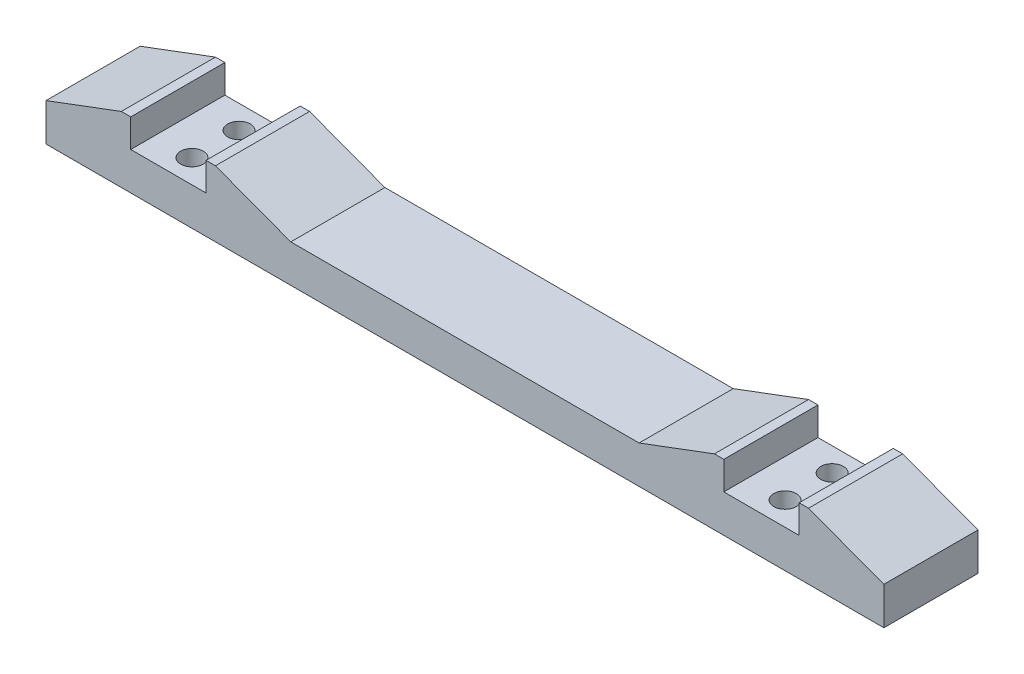
ISO-10303-21;
HEADER;
FILE_DESCRIPTION(('STEP AP214'),'2;1');
FILE_NAME('part.step','',(''),(''),'','','');
FILE_SCHEMA(('AUTOMOTIVE_DESIGN { 1 0 10303 214 1 1 1 1 }'));
ENDSEC;
DATA;
#1=APPLICATION_CONTEXT('core data for automotive mechanical design processes');
#2=APPLICATION_PROTOCOL_DEFINITION('international standard','automotive_design',2000,#1);
#3=PRODUCT_CONTEXT('',#1,'mechanical');
#4=PRODUCT('Part','Part','',(#3));
#5=PRODUCT_RELATED_PRODUCT_CATEGORY('part','',(#4));
#6=PRODUCT_DEFINITION_FORMATION('','',#4);
#7=PRODUCT_DEFINITION_CONTEXT('part definition',#1,'design');
#8=PRODUCT_DEFINITION('design','',#6,#7);
#9=PRODUCT_DEFINITION_SHAPE('','',#8);
#10=(LENGTH_UNIT() NAMED_UNIT(*) SI_UNIT(.MILLI.,.METRE.));
#11=(NAMED_UNIT(*) PLANE_ANGLE_UNIT() SI_UNIT($,.RADIAN.));
#12=(NAMED_UNIT(*) SI_UNIT($,.STERADIAN.) SOLID_ANGLE_UNIT());
#13=UNCERTAINTY_MEASURE_WITH_UNIT(LENGTH_MEASURE(1.E-05),#10,'distance_accuracy_value','');
#14=(GEOMETRIC_REPRESENTATION_CONTEXT(3) GLOBAL_UNCERTAINTY_ASSIGNED_CONTEXT((#13)) GLOBAL_UNIT_ASSIGNED_CONTEXT((#10,
#11,#12)) REPRESENTATION_CONTEXT('',''));
#15=CARTESIAN_POINT('',(0.,0.,0.));
#16=DIRECTION('',(0.,0.,1.));
#17=DIRECTION('',(1.,0.,0.));
#18=AXIS2_PLACEMENT_3D('',#15,#16,#17);
#19=CARTESIAN_POINT('',(2.,-3.5,1.25));
#20=DIRECTION('',(0.,1.,0.));
#21=DIRECTION('',(0.,0.,1.));
#22=AXIS2_PLACEMENT_3D('',#19,#20,#21);
#23=CYLINDRICAL_SURFACE('',#22,0.6);
#24=CARTESIAN_POINT('',(2.,-1.5,1.25));
#25=DIRECTION('',(0.,1.,0.));
#26=DIRECTION('',(0.,0.,1.));
#27=AXIS2_PLACEMENT_3D('',#24,#25,#26);
#28=CIRCLE('',#27,0.6);
#29=CARTESIAN_POINT('',(2.,-1.5,1.85));
#30=VERTEX_POINT('',#29);
#31=EDGE_CURVE('E312',#30,#30,#28,.T.);
#32=ORIENTED_EDGE('',*,*,#31,.T.);
#33=EDGE_LOOP('',(#32));
#34=FACE_BOUND('',#33,.T.);
#35=CARTESIAN_POINT('',(2.,-2.5,1.25));
#36=DIRECTION('',(0.,-1.,0.));
#37=DIRECTION('',(1.,0.,0.));
#38=AXIS2_PLACEMENT_3D('',#35,#36,#37);
#39=CIRCLE('',#38,0.6);
#40=CARTESIAN_POINT('',(2.6,-2.5,1.25));
#41=VERTEX_POINT('',#40);
#42=EDGE_CURVE('E47',#41,#41,#39,.F.);
#43=ORIENTED_EDGE('',*,*,#42,.F.);
#44=EDGE_LOOP('',(#43));
#45=FACE_BOUND('',#44,.T.);
#46=ADVANCED_FACE('F43',(#34,#45),#23,.F.);
#47=CARTESIAN_POINT('',(0.,0.,2.5));
#48=DIRECTION('',(0.,-1.,0.));
#49=DIRECTION('',(1.,0.,0.));
#50=AXIS2_PLACEMENT_3D('',#47,#48,#49);
#51=PLANE('',#50);
#52=DIRECTION('',(-1.,0.,0.));
#53=VECTOR('',#52,1.);
#54=CARTESIAN_POINT('',(0.,0.,0.));
#55=LINE('',#54,#53);
#56=CARTESIAN_POINT('',(0.,0.,0.));
#57=VERTEX_POINT('',#56);
#58=CARTESIAN_POINT('',(-0.5,0.,0.));
#59=VERTEX_POINT('',#58);
#60=EDGE_CURVE('E315',#57,#59,#55,.T.);
#61=ORIENTED_EDGE('',*,*,#60,.T.);
#62=DIRECTION('',(0.,0.,-1.));
#63=VECTOR('',#62,1.);
#64=CARTESIAN_POINT('',(-0.5,0.,2.5));
#65=LINE('',#64,#63);
#66=CARTESIAN_POINT('',(-0.5,0.,5.));
#67=VERTEX_POINT('',#66);
#68=EDGE_CURVE('E11',#67,#59,#65,.T.);
#69=ORIENTED_EDGE('',*,*,#68,.F.);
#70=DIRECTION('',(-1.,0.,0.));
#71=VECTOR('',#70,1.);
#72=CARTESIAN_POINT('',(0.,0.,5.));
#73=LINE('',#72,#71);
#74=CARTESIAN_POINT('',(0.,0.,5.));
#75=VERTEX_POINT('',#74);
#76=EDGE_CURVE('E277',#75,#67,#73,.T.);
#77=ORIENTED_EDGE('',*,*,#76,.F.);
#78=DIRECTION('',(0.,0.,-1.));
#79=VECTOR('',#78,1.);
#80=CARTESIAN_POINT('',(0.,0.,2.5));
#81=LINE('',#80,#79);
#82=EDGE_CURVE('E59',#75,#57,#81,.T.);
#83=ORIENTED_EDGE('',*,*,#82,.T.);
#84=EDGE_LOOP('',(#61,#69,#77,#83));
#85=FACE_BOUND('',#84,.T.);
#86=ADVANCED_FACE('F45',(#85),#51,.F.);
#87=CARTESIAN_POINT('',(-0.0616438356164384,0.164383561643836,2.5));
#88=DIRECTION('',(0.351123441588392,-0.936329177569044,0.));
#89=DIRECTION('',(0.936329177569044,0.351123441588392,0.));
#90=AXIS2_PLACEMENT_3D('',#87,#88,#89);
#91=PLANE('',#90);
#92=DIRECTION('',(-0.936329177569044,-0.351123441588392,0.));
#93=VECTOR('',#92,1.);
#94=CARTESIAN_POINT('',(-0.0616438356164384,0.164383561643836,0.));
#95=LINE('',#94,#93);
#96=CARTESIAN_POINT('',(-4.5,-1.5,0.));
#97=VERTEX_POINT('',#96);
#98=EDGE_CURVE('E317',#59,#97,#95,.T.);
#99=ORIENTED_EDGE('',*,*,#98,.T.);
#100=DIRECTION('',(0.,0.,-1.));
#101=VECTOR('',#100,1.);
#102=CARTESIAN_POINT('',(-4.5,-1.5,2.5));
#103=LINE('',#102,#101);
#104=CARTESIAN_POINT('',(-4.5,-1.5,5.));
#105=VERTEX_POINT('',#104);
#106=EDGE_CURVE('E52',#105,#97,#103,.T.);
#107=ORIENTED_EDGE('',*,*,#106,.F.);
#108=DIRECTION('',(-0.936329177569044,-0.351123441588392,0.));
#109=VECTOR('',#108,1.);
#110=CARTESIAN_POINT('',(-0.0616438356164384,0.164383561643836,5.));
#111=LINE('',#110,#109);
#112=EDGE_CURVE('E279',#67,#105,#111,.T.);
#113=ORIENTED_EDGE('',*,*,#112,.F.);
#114=ORIENTED_EDGE('',*,*,#68,.T.);
#115=EDGE_LOOP('',(#99,#107,#113,#114));
#116=FACE_BOUND('',#115,.T.);
#117=ADVANCED_FACE('F361',(#116),#91,.F.);
#118=CARTESIAN_POINT('',(-4.5,0.,2.5));
#119=DIRECTION('',(-1.,0.,0.));
#120=DIRECTION('',(0.,-1.,0.));
#121=AXIS2_PLACEMENT_3D('',#118,#119,#120);
#122=PLANE('',#121);
#123=DIRECTION('',(0.,1.,0.));
#124=VECTOR('',#123,1.);
#125=CARTESIAN_POINT('',(-4.5,0.,0.));
#126=LINE('',#125,#124);
#127=CARTESIAN_POINT('',(-4.5,-3.5,0.));
#128=VERTEX_POINT('',#127);
#129=EDGE_CURVE('E320',#128,#97,#126,.T.);
#130=ORIENTED_EDGE('',*,*,#129,.F.);
#131=DIRECTION('',(0.,0.,-1.));
#132=VECTOR('',#131,1.);
#133=CARTESIAN_POINT('',(-4.5,-3.5,2.5));
#134=LINE('',#133,#132);
#135=CARTESIAN_POINT('',(-4.5,-3.5,5.));
#136=VERTEX_POINT('',#135);
#137=EDGE_CURVE('E353',#136,#128,#134,.T.);
#138=ORIENTED_EDGE('',*,*,#137,.F.);
#139=DIRECTION('',(0.,1.,0.));
#140=VECTOR('',#139,1.);
#141=CARTESIAN_POINT('',(-4.5,0.,5.));
#142=LINE('',#141,#140);
#143=EDGE_CURVE('E282',#136,#105,#142,.T.);
#144=ORIENTED_EDGE('',*,*,#143,.T.);
#145=ORIENTED_EDGE('',*,*,#106,.T.);
#146=EDGE_LOOP('',(#130,#138,#144,#145));
#147=FACE_BOUND('',#146,.T.);
#148=ADVANCED_FACE('F357',(#147),#122,.T.);
#149=CARTESIAN_POINT('',(0.,-3.5,2.5));
#150=DIRECTION('',(0.,-1.,0.));
#151=DIRECTION('',(1.,0.,0.));
#152=AXIS2_PLACEMENT_3D('',#149,#150,#151);
#153=PLANE('',#152);
#154=CARTESIAN_POINT('',(2.,-3.5,1.25));
#155=DIRECTION('',(0.,-1.,0.));
#156=DIRECTION('',(1.,0.,0.));
#157=AXIS2_PLACEMENT_3D('',#154,#155,#156);
#158=CIRCLE('',#157,1.);
#159=CARTESIAN_POINT('',(3.,-3.5,1.25));
#160=VERTEX_POINT('',#159);
#161=EDGE_CURVE('E304',#160,#160,#158,.T.);
#162=ORIENTED_EDGE('',*,*,#161,.F.);
#163=EDGE_LOOP('',(#162));
#164=FACE_BOUND('',#163,.T.);
#165=DIRECTION('',(-1.,0.,0.));
#166=VECTOR('',#165,1.);
#167=CARTESIAN_POINT('',(0.,-3.5,0.));
#168=LINE('',#167,#166);
#169=CARTESIAN_POINT('',(40.,-3.50000000000008,0.));
#170=VERTEX_POINT('',#169);
#171=EDGE_CURVE('E323',#170,#128,#168,.T.);
#172=ORIENTED_EDGE('',*,*,#171,.F.);
#173=DIRECTION('',(0.,0.,-1.));
#174=VECTOR('',#173,1.);
#175=CARTESIAN_POINT('',(40.,-3.50000000000008,2.5));
#176=LINE('',#175,#174);
#177=CARTESIAN_POINT('',(40.,-3.50000000000008,5.));
#178=VERTEX_POINT('',#177);
#179=EDGE_CURVE('E262',#178,#170,#176,.T.);
#180=ORIENTED_EDGE('',*,*,#179,.F.);
#181=DIRECTION('',(-1.,0.,0.));
#182=VECTOR('',#181,1.);
#183=CARTESIAN_POINT('',(0.,-3.5,5.));
#184=LINE('',#183,#182);
#185=EDGE_CURVE('E285',#178,#136,#184,.T.);
#186=ORIENTED_EDGE('',*,*,#185,.T.);
#187=ORIENTED_EDGE('',*,*,#137,.T.);
#188=EDGE_LOOP('',(#172,#180,#186,#187));
#189=FACE_BOUND('',#188,.T.);
#190=CARTESIAN_POINT('',(2.,-3.5,3.75));
#191=DIRECTION('',(0.,1.,0.));
#192=DIRECTION('',(1.,0.,0.));
#193=AXIS2_PLACEMENT_3D('',#190,#191,#192);
#194=CIRCLE('',#193,1.);
#195=CARTESIAN_POINT('',(3.,-3.5,3.75));
#196=VERTEX_POINT('',#195);
#197=EDGE_CURVE('E192',#196,#196,#194,.T.);
#198=ORIENTED_EDGE('',*,*,#197,.T.);
#199=EDGE_LOOP('',(#198));
#200=FACE_BOUND('',#199,.T.);
#201=CARTESIAN_POINT('',(33.5,-3.50000000000005,1.25));
#202=DIRECTION('',(0.,1.,0.));
#203=DIRECTION('',(-1.,0.,0.));
#204=AXIS2_PLACEMENT_3D('',#201,#202,#203);
#205=CIRCLE('',#204,1.);
#206=CARTESIAN_POINT('',(32.5,-3.50000000000005,1.25));
#207=VERTEX_POINT('',#206);
#208=EDGE_CURVE('E217',#207,#207,#205,.T.);
#209=ORIENTED_EDGE('',*,*,#208,.T.);
#210=EDGE_LOOP('',(#209));
#211=FACE_BOUND('',#210,.T.);
#212=CARTESIAN_POINT('',(33.5,-3.50000000000005,3.75));
#213=DIRECTION('',(0.,-1.,0.));
#214=DIRECTION('',(-1.,0.,0.));
#215=AXIS2_PLACEMENT_3D('',#212,#213,#214);
#216=CIRCLE('',#215,1.);
#217=CARTESIAN_POINT('',(32.5,-3.50000000000005,3.75));
#218=VERTEX_POINT('',#217);
#219=EDGE_CURVE('E503',#218,#218,#216,.T.);
#220=ORIENTED_EDGE('',*,*,#219,.F.);
#221=EDGE_LOOP('',(#220));
#222=FACE_BOUND('',#221,.T.);
#223=ADVANCED_FACE('F367',(#164,#189,#200,#211,#222),#153,.T.);
#224=CARTESIAN_POINT('',(0.,-1.5,2.5));
#225=DIRECTION('',(0.,1.,0.));
#226=DIRECTION('',(0.,0.,1.));
#227=AXIS2_PLACEMENT_3D('',#224,#225,#226);
#228=PLANE('',#227);
#229=DIRECTION('',(1.,0.,0.));
#230=VECTOR('',#229,1.);
#231=CARTESIAN_POINT('',(0.,-1.5,0.));
#232=LINE('',#231,#230);
#233=CARTESIAN_POINT('',(8.5,-1.5,0.));
#234=VERTEX_POINT('',#233);
#235=CARTESIAN_POINT('',(27.,-1.50000000000003,0.));
#236=VERTEX_POINT('',#235);
#237=EDGE_CURVE('E326',#234,#236,#232,.T.);
#238=ORIENTED_EDGE('',*,*,#237,.F.);
#239=DIRECTION('',(0.,0.,-1.));
#240=VECTOR('',#239,1.);
#241=CARTESIAN_POINT('',(8.5,-1.5,2.5));
#242=LINE('',#241,#240);
#243=CARTESIAN_POINT('',(8.5,-1.5,5.));
#244=VERTEX_POINT('',#243);
#245=EDGE_CURVE('E351',#244,#234,#242,.T.);
#246=ORIENTED_EDGE('',*,*,#245,.F.);
#247=DIRECTION('',(1.,0.,0.));
#248=VECTOR('',#247,1.);
#249=CARTESIAN_POINT('',(0.,-1.5,5.));
#250=LINE('',#249,#248);
#251=CARTESIAN_POINT('',(27.,-1.50000000000003,5.));
#252=VERTEX_POINT('',#251);
#253=EDGE_CURVE('E288',#244,#252,#250,.T.);
#254=ORIENTED_EDGE('',*,*,#253,.T.);
#255=DIRECTION('',(0.,0.,-1.));
#256=VECTOR('',#255,1.);
#257=CARTESIAN_POINT('',(27.,-1.50000000000003,2.5));
#258=LINE('',#257,#256);
#259=EDGE_CURVE('E259',#252,#236,#258,.T.);
#260=ORIENTED_EDGE('',*,*,#259,.T.);
#261=EDGE_LOOP('',(#238,#246,#254,#260));
#262=FACE_BOUND('',#261,.T.);
#263=ADVANCED_FACE('F399',(#262),#228,.T.);
#264=CARTESIAN_POINT('',(0.554794520547946,1.47945205479452,2.5));
#265=DIRECTION('',(0.351123441588392,0.936329177569045,0.));
#266=DIRECTION('',(-0.936329177569045,0.351123441588392,0.));
#267=AXIS2_PLACEMENT_3D('',#264,#265,#266);
#268=PLANE('',#267);
#269=DIRECTION('',(0.936329177569045,-0.351123441588392,0.));
#270=VECTOR('',#269,1.);
#271=CARTESIAN_POINT('',(0.554794520547946,1.47945205479452,0.));
#272=LINE('',#271,#270);
#273=CARTESIAN_POINT('',(4.5,0.,0.));
#274=VERTEX_POINT('',#273);
#275=EDGE_CURVE('E328',#274,#234,#272,.T.);
#276=ORIENTED_EDGE('',*,*,#275,.F.);
#277=DIRECTION('',(0.,0.,-1.));
#278=VECTOR('',#277,1.);
#279=CARTESIAN_POINT('',(4.5,0.,2.5));
#280=LINE('',#279,#278);
#281=CARTESIAN_POINT('',(4.5,0.,5.));
#282=VERTEX_POINT('',#281);
#283=EDGE_CURVE('E349',#282,#274,#280,.T.);
#284=ORIENTED_EDGE('',*,*,#283,.F.);
#285=DIRECTION('',(0.936329177569045,-0.351123441588392,0.));
#286=VECTOR('',#285,1.);
#287=CARTESIAN_POINT('',(0.554794520547946,1.47945205479452,5.));
#288=LINE('',#287,#286);
#289=EDGE_CURVE('E290',#282,#244,#288,.T.);
#290=ORIENTED_EDGE('',*,*,#289,.T.);
#291=ORIENTED_EDGE('',*,*,#245,.T.);
#292=EDGE_LOOP('',(#276,#284,#290,#291));
#293=FACE_BOUND('',#292,.T.);
#294=ADVANCED_FACE('F402',(#293),#268,.T.);
#295=CARTESIAN_POINT('',(0.,0.,2.5));
#296=DIRECTION('',(0.,1.,0.));
#297=DIRECTION('',(0.,0.,1.));
#298=AXIS2_PLACEMENT_3D('',#295,#296,#297);
#299=PLANE('',#298);
#300=DIRECTION('',(1.,0.,0.));
#301=VECTOR('',#300,1.);
#302=CARTESIAN_POINT('',(0.,0.,0.));
#303=LINE('',#302,#301);
#304=CARTESIAN_POINT('',(4.,0.,0.));
#305=VERTEX_POINT('',#304);
#306=EDGE_CURVE('E331',#305,#274,#303,.T.);
#307=ORIENTED_EDGE('',*,*,#306,.F.);
#308=DIRECTION('',(0.,0.,-1.));
#309=VECTOR('',#308,1.);
#310=CARTESIAN_POINT('',(4.,0.,2.5));
#311=LINE('',#310,#309);
#312=CARTESIAN_POINT('',(4.,0.,5.));
#313=VERTEX_POINT('',#312);
#314=EDGE_CURVE('E347',#313,#305,#311,.T.);
#315=ORIENTED_EDGE('',*,*,#314,.F.);
#316=DIRECTION('',(1.,0.,0.));
#317=VECTOR('',#316,1.);
#318=CARTESIAN_POINT('',(0.,0.,5.));
#319=LINE('',#318,#317);
#320=EDGE_CURVE('E293',#313,#282,#319,.T.);
#321=ORIENTED_EDGE('',*,*,#320,.T.);
#322=ORIENTED_EDGE('',*,*,#283,.T.);
#323=EDGE_LOOP('',(#307,#315,#321,#322));
#324=FACE_BOUND('',#323,.T.);
#325=ADVANCED_FACE('F408',(#324),#299,.T.);
#326=CARTESIAN_POINT('',(4.,0.,2.5));
#327=DIRECTION('',(-1.,0.,0.));
#328=DIRECTION('',(0.,0.,1.));
#329=AXIS2_PLACEMENT_3D('',#326,#327,#328);
#330=PLANE('',#329);
#331=DIRECTION('',(0.,1.,0.));
#332=VECTOR('',#331,1.);
#333=CARTESIAN_POINT('',(4.,0.,0.));
#334=LINE('',#333,#332);
#335=CARTESIAN_POINT('',(4.,-1.5,0.));
#336=VERTEX_POINT('',#335);
#337=EDGE_CURVE('E334',#336,#305,#334,.T.);
#338=ORIENTED_EDGE('',*,*,#337,.F.);
#339=DIRECTION('',(0.,0.,-1.));
#340=VECTOR('',#339,1.);
#341=CARTESIAN_POINT('',(4.,-1.5,2.5));
#342=LINE('',#341,#340);
#343=CARTESIAN_POINT('',(4.,-1.5,5.));
#344=VERTEX_POINT('',#343);
#345=EDGE_CURVE('E345',#344,#336,#342,.T.);
#346=ORIENTED_EDGE('',*,*,#345,.F.);
#347=DIRECTION('',(0.,1.,0.));
#348=VECTOR('',#347,1.);
#349=CARTESIAN_POINT('',(4.,0.,5.));
#350=LINE('',#349,#348);
#351=EDGE_CURVE('E296',#344,#313,#350,.T.);
#352=ORIENTED_EDGE('',*,*,#351,.T.);
#353=ORIENTED_EDGE('',*,*,#314,.T.);
#354=EDGE_LOOP('',(#338,#346,#352,#353));
#355=FACE_BOUND('',#354,.T.);
#356=ADVANCED_FACE('F411',(#355),#330,.T.);
#357=CARTESIAN_POINT('',(0.,-1.5,2.5));
#358=DIRECTION('',(0.,1.,0.));
#359=DIRECTION('',(0.,0.,1.));
#360=AXIS2_PLACEMENT_3D('',#357,#358,#359);
#361=PLANE('',#360);
#362=ORIENTED_EDGE('',*,*,#31,.F.);
#363=EDGE_LOOP('',(#362));
#364=FACE_BOUND('',#363,.T.);
#365=DIRECTION('',(1.,0.,0.));
#366=VECTOR('',#365,1.);
#367=CARTESIAN_POINT('',(0.,-1.5,0.));
#368=LINE('',#367,#366);
#369=CARTESIAN_POINT('',(0.,-1.5,0.));
#370=VERTEX_POINT('',#369);
#371=EDGE_CURVE('E337',#370,#336,#368,.T.);
#372=ORIENTED_EDGE('',*,*,#371,.F.);
#373=DIRECTION('',(0.,0.,-1.));
#374=VECTOR('',#373,1.);
#375=CARTESIAN_POINT('',(0.,-1.5,2.5));
#376=LINE('',#375,#374);
#377=CARTESIAN_POINT('',(0.,-1.5,5.));
#378=VERTEX_POINT('',#377);
#379=EDGE_CURVE('E67',#378,#370,#376,.T.);
#380=ORIENTED_EDGE('',*,*,#379,.F.);
#381=DIRECTION('',(1.,0.,0.));
#382=VECTOR('',#381,1.);
#383=CARTESIAN_POINT('',(0.,-1.5,5.));
#384=LINE('',#383,#382);
#385=EDGE_CURVE('E299',#378,#344,#384,.T.);
#386=ORIENTED_EDGE('',*,*,#385,.T.);
#387=ORIENTED_EDGE('',*,*,#345,.T.);
#388=EDGE_LOOP('',(#372,#380,#386,#387));
#389=FACE_BOUND('',#388,.T.);
#390=CARTESIAN_POINT('',(2.,-1.5,3.75));
#391=DIRECTION('',(0.,-1.,0.));
#392=DIRECTION('',(0.,0.,-1.));
#393=AXIS2_PLACEMENT_3D('',#390,#391,#392);
#394=CIRCLE('',#393,0.6);
#395=CARTESIAN_POINT('',(2.,-1.5,3.15));
#396=VERTEX_POINT('',#395);
#397=EDGE_CURVE('E274',#396,#396,#394,.T.);
#398=ORIENTED_EDGE('',*,*,#397,.T.);
#399=EDGE_LOOP('',(#398));
#400=FACE_BOUND('',#399,.T.);
#401=ADVANCED_FACE('F413',(#364,#389,#400),#361,.T.);
#402=CARTESIAN_POINT('',(0.,0.,2.5));
#403=DIRECTION('',(1.,0.,0.));
#404=DIRECTION('',(0.,1.,0.));
#405=AXIS2_PLACEMENT_3D('',#402,#403,#404);
#406=PLANE('',#405);
#407=DIRECTION('',(0.,-1.,0.));
#408=VECTOR('',#407,1.);
#409=CARTESIAN_POINT('',(0.,0.,0.));
#410=LINE('',#409,#408);
#411=EDGE_CURVE('E340',#57,#370,#410,.T.);
#412=ORIENTED_EDGE('',*,*,#411,.F.);
#413=ORIENTED_EDGE('',*,*,#82,.F.);
#414=DIRECTION('',(0.,-1.,0.));
#415=VECTOR('',#414,1.);
#416=CARTESIAN_POINT('',(0.,0.,5.));
#417=LINE('',#416,#415);
#418=EDGE_CURVE('E302',#75,#378,#417,.T.);
#419=ORIENTED_EDGE('',*,*,#418,.T.);
#420=ORIENTED_EDGE('',*,*,#379,.T.);
#421=EDGE_LOOP('',(#412,#413,#419,#420));
#422=FACE_BOUND('',#421,.T.);
#423=ADVANCED_FACE('F416',(#422),#406,.T.);
#424=CARTESIAN_POINT('',(0.,0.,0.));
#425=DIRECTION('',(0.,0.,1.));
#426=DIRECTION('',(1.,0.,0.));
#427=AXIS2_PLACEMENT_3D('',#424,#425,#426);
#428=PLANE('',#427);
#429=ORIENTED_EDGE('',*,*,#60,.F.);
#430=ORIENTED_EDGE('',*,*,#411,.T.);
#431=ORIENTED_EDGE('',*,*,#371,.T.);
#432=ORIENTED_EDGE('',*,*,#337,.T.);
#433=ORIENTED_EDGE('',*,*,#306,.T.);
#434=ORIENTED_EDGE('',*,*,#275,.T.);
#435=ORIENTED_EDGE('',*,*,#237,.T.);
#436=DIRECTION('',(-0.936329177569046,-0.351123441588389,0.));
#437=VECTOR('',#436,1.);
#438=CARTESIAN_POINT('',(34.9452054794521,1.47945205479446,0.));
#439=LINE('',#438,#437);
#440=CARTESIAN_POINT('',(31.,0.,0.));
#441=VERTEX_POINT('',#440);
#442=EDGE_CURVE('E235',#441,#236,#439,.T.);
#443=ORIENTED_EDGE('',*,*,#442,.F.);
#444=DIRECTION('',(-1.,0.,0.));
#445=VECTOR('',#444,1.);
#446=CARTESIAN_POINT('',(35.5,0.,0.));
#447=LINE('',#446,#445);
#448=CARTESIAN_POINT('',(31.5,0.,0.));
#449=VERTEX_POINT('',#448);
#450=EDGE_CURVE('E238',#449,#441,#447,.T.);
#451=ORIENTED_EDGE('',*,*,#450,.F.);
#452=DIRECTION('',(0.,1.,0.));
#453=VECTOR('',#452,1.);
#454=CARTESIAN_POINT('',(31.5,0.,0.));
#455=LINE('',#454,#453);
#456=CARTESIAN_POINT('',(31.5,-1.50000000000005,0.));
#457=VERTEX_POINT('',#456);
#458=EDGE_CURVE('E240',#457,#449,#455,.T.);
#459=ORIENTED_EDGE('',*,*,#458,.F.);
#460=DIRECTION('',(-1.,0.,0.));
#461=VECTOR('',#460,1.);
#462=CARTESIAN_POINT('',(35.5,-1.50000000000006,0.));
#463=LINE('',#462,#461);
#464=CARTESIAN_POINT('',(35.5,-1.50000000000006,0.));
#465=VERTEX_POINT('',#464);
#466=EDGE_CURVE('E242',#465,#457,#463,.T.);
#467=ORIENTED_EDGE('',*,*,#466,.F.);
#468=DIRECTION('',(0.,-1.,0.));
#469=VECTOR('',#468,1.);
#470=CARTESIAN_POINT('',(35.5,0.,0.));
#471=LINE('',#470,#469);
#472=CARTESIAN_POINT('',(35.5,0.,0.));
#473=VERTEX_POINT('',#472);
#474=EDGE_CURVE('E244',#473,#465,#471,.T.);
#475=ORIENTED_EDGE('',*,*,#474,.F.);
#476=DIRECTION('',(1.,0.,0.));
#477=VECTOR('',#476,1.);
#478=CARTESIAN_POINT('',(35.5,0.,0.));
#479=LINE('',#478,#477);
#480=CARTESIAN_POINT('',(36.,0.,0.));
#481=VERTEX_POINT('',#480);
#482=EDGE_CURVE('E230',#473,#481,#479,.T.);
#483=ORIENTED_EDGE('',*,*,#482,.T.);
#484=DIRECTION('',(0.936329177569043,-0.351123441588395,0.));
#485=VECTOR('',#484,1.);
#486=CARTESIAN_POINT('',(35.5616438356165,0.164383561643774,0.));
#487=LINE('',#486,#485);
#488=CARTESIAN_POINT('',(40.,-1.50000000000008,0.));
#489=VERTEX_POINT('',#488);
#490=EDGE_CURVE('E188',#481,#489,#487,.T.);
#491=ORIENTED_EDGE('',*,*,#490,.T.);
#492=DIRECTION('',(0.,1.,0.));
#493=VECTOR('',#492,1.);
#494=CARTESIAN_POINT('',(40.,0.,0.));
#495=LINE('',#494,#493);
#496=EDGE_CURVE('E233',#170,#489,#495,.T.);
#497=ORIENTED_EDGE('',*,*,#496,.F.);
#498=ORIENTED_EDGE('',*,*,#171,.T.);
#499=ORIENTED_EDGE('',*,*,#129,.T.);
#500=ORIENTED_EDGE('',*,*,#98,.F.);
#501=EDGE_LOOP('',(#429,#430,#431,#432,#433,#434,#435,#443,#451,#459,#467,#475,#483,#491,#497,
#498,#499,#500));
#502=FACE_BOUND('',#501,.T.);
#503=ADVANCED_FACE('F363',(#502),#428,.F.);
#504=CARTESIAN_POINT('',(2.,-2.5,1.25));
#505=DIRECTION('',(0.,-1.,0.));
#506=DIRECTION('',(1.,0.,0.));
#507=AXIS2_PLACEMENT_3D('',#504,#505,#506);
#508=PLANE('',#507);
#509=CARTESIAN_POINT('',(2.,-2.5,1.25));
#510=DIRECTION('',(0.,-1.,0.));
#511=DIRECTION('',(1.,0.,0.));
#512=AXIS2_PLACEMENT_3D('',#509,#510,#511);
#513=CIRCLE('',#512,1.);
#514=CARTESIAN_POINT('',(3.,-2.5,1.25));
#515=VERTEX_POINT('',#514);
#516=EDGE_CURVE('E307',#515,#515,#513,.T.);
#517=ORIENTED_EDGE('',*,*,#516,.T.);
#518=EDGE_LOOP('',(#517));
#519=FACE_BOUND('',#518,.T.);
#520=ORIENTED_EDGE('',*,*,#42,.T.);
#521=EDGE_LOOP('',(#520));
#522=FACE_BOUND('',#521,.T.);
#523=ADVANCED_FACE('F423',(#519,#522),#508,.T.);
#524=CARTESIAN_POINT('',(2.,-2.5,1.25));
#525=DIRECTION('',(0.,-1.,0.));
#526=DIRECTION('',(0.,0.,-1.));
#527=AXIS2_PLACEMENT_3D('',#524,#525,#526);
#528=CYLINDRICAL_SURFACE('',#527,1.);
#529=ORIENTED_EDGE('',*,*,#516,.F.);
#530=EDGE_LOOP('',(#529));
#531=FACE_BOUND('',#530,.T.);
#532=ORIENTED_EDGE('',*,*,#161,.T.);
#533=EDGE_LOOP('',(#532));
#534=FACE_BOUND('',#533,.T.);
#535=ADVANCED_FACE('F435',(#531,#534),#528,.F.);
#536=CARTESIAN_POINT('',(2.,-3.5,3.75));
#537=DIRECTION('',(0.,1.,0.));
#538=DIRECTION('',(0.,0.,-1.));
#539=AXIS2_PLACEMENT_3D('',#536,#537,#538);
#540=CYLINDRICAL_SURFACE('',#539,0.6);
#541=ORIENTED_EDGE('',*,*,#397,.F.);
#542=EDGE_LOOP('',(#541));
#543=FACE_BOUND('',#542,.T.);
#544=CARTESIAN_POINT('',(2.,-2.5,3.75));
#545=DIRECTION('',(0.,1.,0.));
#546=DIRECTION('',(1.,0.,0.));
#547=AXIS2_PLACEMENT_3D('',#544,#545,#546);
#548=CIRCLE('',#547,0.6);
#549=CARTESIAN_POINT('',(2.6,-2.5,3.75));
#550=VERTEX_POINT('',#549);
#551=EDGE_CURVE('E271',#550,#550,#548,.F.);
#552=ORIENTED_EDGE('',*,*,#551,.T.);
#553=EDGE_LOOP('',(#552));
#554=FACE_BOUND('',#553,.T.);
#555=ADVANCED_FACE('F438',(#543,#554),#540,.F.);
#556=CARTESIAN_POINT('',(0.,0.,5.));
#557=DIRECTION('',(0.,0.,-1.));
#558=DIRECTION('',(1.,0.,0.));
#559=AXIS2_PLACEMENT_3D('',#556,#557,#558);
#560=PLANE('',#559);
#561=ORIENTED_EDGE('',*,*,#76,.T.);
#562=ORIENTED_EDGE('',*,*,#112,.T.);
#563=ORIENTED_EDGE('',*,*,#143,.F.);
#564=ORIENTED_EDGE('',*,*,#185,.F.);
#565=DIRECTION('',(0.,1.,0.));
#566=VECTOR('',#565,1.);
#567=CARTESIAN_POINT('',(40.,0.,5.));
#568=LINE('',#567,#566);
#569=CARTESIAN_POINT('',(40.,-1.50000000000008,5.));
#570=VERTEX_POINT('',#569);
#571=EDGE_CURVE('E179',#178,#570,#568,.T.);
#572=ORIENTED_EDGE('',*,*,#571,.T.);
#573=DIRECTION('',(0.936329177569043,-0.351123441588395,0.));
#574=VECTOR('',#573,1.);
#575=CARTESIAN_POINT('',(35.5616438356165,0.164383561643774,5.));
#576=LINE('',#575,#574);
#577=CARTESIAN_POINT('',(36.,0.,5.));
#578=VERTEX_POINT('',#577);
#579=EDGE_CURVE('E171',#578,#570,#576,.T.);
#580=ORIENTED_EDGE('',*,*,#579,.F.);
#581=DIRECTION('',(1.,0.,0.));
#582=VECTOR('',#581,1.);
#583=CARTESIAN_POINT('',(35.5,0.,5.));
#584=LINE('',#583,#582);
#585=CARTESIAN_POINT('',(35.5,0.,5.));
#586=VERTEX_POINT('',#585);
#587=EDGE_CURVE('E176',#586,#578,#584,.T.);
#588=ORIENTED_EDGE('',*,*,#587,.F.);
#589=DIRECTION('',(0.,-1.,0.));
#590=VECTOR('',#589,1.);
#591=CARTESIAN_POINT('',(35.5,0.,5.));
#592=LINE('',#591,#590);
#593=CARTESIAN_POINT('',(35.5,-1.50000000000006,5.));
#594=VERTEX_POINT('',#593);
#595=EDGE_CURVE('E215',#586,#594,#592,.T.);
#596=ORIENTED_EDGE('',*,*,#595,.T.);
#597=DIRECTION('',(-1.,0.,0.));
#598=VECTOR('',#597,1.);
#599=CARTESIAN_POINT('',(35.5,-1.50000000000006,5.));
#600=LINE('',#599,#598);
#601=CARTESIAN_POINT('',(31.5,-1.50000000000005,5.));
#602=VERTEX_POINT('',#601);
#603=EDGE_CURVE('E213',#594,#602,#600,.T.);
#604=ORIENTED_EDGE('',*,*,#603,.T.);
#605=DIRECTION('',(0.,1.,0.));
#606=VECTOR('',#605,1.);
#607=CARTESIAN_POINT('',(31.5,0.,5.));
#608=LINE('',#607,#606);
#609=CARTESIAN_POINT('',(31.5,0.,5.));
#610=VERTEX_POINT('',#609);
#611=EDGE_CURVE('E211',#602,#610,#608,.T.);
#612=ORIENTED_EDGE('',*,*,#611,.T.);
#613=DIRECTION('',(-1.,0.,0.));
#614=VECTOR('',#613,1.);
#615=CARTESIAN_POINT('',(35.5,0.,5.));
#616=LINE('',#615,#614);
#617=CARTESIAN_POINT('',(31.,0.,5.));
#618=VERTEX_POINT('',#617);
#619=EDGE_CURVE('E209',#610,#618,#616,.T.);
#620=ORIENTED_EDGE('',*,*,#619,.T.);
#621=DIRECTION('',(-0.936329177569046,-0.351123441588389,0.));
#622=VECTOR('',#621,1.);
#623=CARTESIAN_POINT('',(34.9452054794521,1.47945205479446,5.));
#624=LINE('',#623,#622);
#625=EDGE_CURVE('E206',#618,#252,#624,.T.);
#626=ORIENTED_EDGE('',*,*,#625,.T.);
#627=ORIENTED_EDGE('',*,*,#253,.F.);
#628=ORIENTED_EDGE('',*,*,#289,.F.);
#629=ORIENTED_EDGE('',*,*,#320,.F.);
#630=ORIENTED_EDGE('',*,*,#351,.F.);
#631=ORIENTED_EDGE('',*,*,#385,.F.);
#632=ORIENTED_EDGE('',*,*,#418,.F.);
#633=EDGE_LOOP('',(#561,#562,#563,#564,#572,#580,#588,#596,#604,#612,#620,#626,#627,#628,#629,
#630,#631,#632));
#634=FACE_BOUND('',#633,.T.);
#635=ADVANCED_FACE('F174',(#634),#560,.F.);
#636=CARTESIAN_POINT('',(2.,-2.5,3.75));
#637=DIRECTION('',(0.,-1.,0.));
#638=DIRECTION('',(1.,0.,0.));
#639=AXIS2_PLACEMENT_3D('',#636,#637,#638);
#640=PLANE('',#639);
#641=CARTESIAN_POINT('',(2.,-2.5,3.75));
#642=DIRECTION('',(0.,1.,0.));
#643=DIRECTION('',(1.,0.,0.));
#644=AXIS2_PLACEMENT_3D('',#641,#642,#643);
#645=CIRCLE('',#644,1.);
#646=CARTESIAN_POINT('',(3.,-2.5,3.75));
#647=VERTEX_POINT('',#646);
#648=EDGE_CURVE('E268',#647,#647,#645,.T.);
#649=ORIENTED_EDGE('',*,*,#648,.F.);
#650=EDGE_LOOP('',(#649));
#651=FACE_BOUND('',#650,.T.);
#652=ORIENTED_EDGE('',*,*,#551,.F.);
#653=EDGE_LOOP('',(#652));
#654=FACE_BOUND('',#653,.T.);
#655=ADVANCED_FACE('F445',(#651,#654),#640,.T.);
#656=CARTESIAN_POINT('',(2.,-2.5,3.75));
#657=DIRECTION('',(0.,-1.,0.));
#658=DIRECTION('',(0.,0.,1.));
#659=AXIS2_PLACEMENT_3D('',#656,#657,#658);
#660=CYLINDRICAL_SURFACE('',#659,1.);
#661=ORIENTED_EDGE('',*,*,#648,.T.);
#662=EDGE_LOOP('',(#661));
#663=FACE_BOUND('',#662,.T.);
#664=ORIENTED_EDGE('',*,*,#197,.F.);
#665=EDGE_LOOP('',(#664));
#666=FACE_BOUND('',#665,.T.);
#667=ADVANCED_FACE('F449',(#663,#666),#660,.F.);
#668=CARTESIAN_POINT('',(33.5,-3.50000000000006,1.25));
#669=DIRECTION('',(0.,1.,0.));
#670=DIRECTION('',(0.,0.,1.));
#671=AXIS2_PLACEMENT_3D('',#668,#669,#670);
#672=CYLINDRICAL_SURFACE('',#671,0.6);
#673=CARTESIAN_POINT('',(33.5,-1.50000000000005,1.25));
#674=DIRECTION('',(0.,-1.,0.));
#675=DIRECTION('',(0.,0.,1.));
#676=AXIS2_PLACEMENT_3D('',#673,#674,#675);
#677=CIRCLE('',#676,0.6);
#678=CARTESIAN_POINT('',(33.5,-1.50000000000005,1.85));
#679=VERTEX_POINT('',#678);
#680=EDGE_CURVE('E227',#679,#679,#677,.T.);
#681=ORIENTED_EDGE('',*,*,#680,.F.);
#682=EDGE_LOOP('',(#681));
#683=FACE_BOUND('',#682,.T.);
#684=CARTESIAN_POINT('',(33.5,-2.50000000000005,1.25));
#685=DIRECTION('',(0.,1.,0.));
#686=DIRECTION('',(-1.,0.,0.));
#687=AXIS2_PLACEMENT_3D('',#684,#685,#686);
#688=CIRCLE('',#687,0.6);
#689=CARTESIAN_POINT('',(32.9,-2.50000000000005,1.25));
#690=VERTEX_POINT('',#689);
#691=EDGE_CURVE('E224',#690,#690,#688,.F.);
#692=ORIENTED_EDGE('',*,*,#691,.T.);
#693=EDGE_LOOP('',(#692));
#694=FACE_BOUND('',#693,.T.);
#695=ADVANCED_FACE('F452',(#683,#694),#672,.F.);
#696=CARTESIAN_POINT('',(35.5,0.,2.5));
#697=DIRECTION('',(0.,-1.,0.));
#698=DIRECTION('',(-1.,0.,0.));
#699=AXIS2_PLACEMENT_3D('',#696,#697,#698);
#700=PLANE('',#699);
#701=ORIENTED_EDGE('',*,*,#482,.F.);
#702=DIRECTION('',(0.,0.,-1.));
#703=VECTOR('',#702,1.);
#704=CARTESIAN_POINT('',(35.5,0.,2.5));
#705=LINE('',#704,#703);
#706=EDGE_CURVE('E197',#586,#473,#705,.T.);
#707=ORIENTED_EDGE('',*,*,#706,.F.);
#708=ORIENTED_EDGE('',*,*,#587,.T.);
#709=DIRECTION('',(0.,0.,-1.));
#710=VECTOR('',#709,1.);
#711=CARTESIAN_POINT('',(36.,0.,2.5));
#712=LINE('',#711,#710);
#713=EDGE_CURVE('E185',#578,#481,#712,.T.);
#714=ORIENTED_EDGE('',*,*,#713,.T.);
#715=EDGE_LOOP('',(#701,#707,#708,#714));
#716=FACE_BOUND('',#715,.T.);
#717=ADVANCED_FACE('F195',(#716),#700,.F.);
#718=CARTESIAN_POINT('',(35.5616438356165,0.164383561643774,2.5));
#719=DIRECTION('',(-0.351123441588395,-0.936329177569043,0.));
#720=DIRECTION('',(-0.936329177569043,0.351123441588395,0.));
#721=AXIS2_PLACEMENT_3D('',#718,#719,#720);
#722=PLANE('',#721);
#723=ORIENTED_EDGE('',*,*,#490,.F.);
#724=ORIENTED_EDGE('',*,*,#713,.F.);
#725=ORIENTED_EDGE('',*,*,#579,.T.);
#726=DIRECTION('',(0.,0.,-1.));
#727=VECTOR('',#726,1.);
#728=CARTESIAN_POINT('',(40.,-1.50000000000008,2.5));
#729=LINE('',#728,#727);
#730=EDGE_CURVE('E193',#570,#489,#729,.T.);
#731=ORIENTED_EDGE('',*,*,#730,.T.);
#732=EDGE_LOOP('',(#723,#724,#725,#731));
#733=FACE_BOUND('',#732,.T.);
#734=ADVANCED_FACE('F186',(#733),#722,.F.);
#735=CARTESIAN_POINT('',(40.,0.,2.5));
#736=DIRECTION('',(1.,0.,0.));
#737=DIRECTION('',(0.,-1.,0.));
#738=AXIS2_PLACEMENT_3D('',#735,#736,#737);
#739=PLANE('',#738);
#740=ORIENTED_EDGE('',*,*,#496,.T.);
#741=ORIENTED_EDGE('',*,*,#730,.F.);
#742=ORIENTED_EDGE('',*,*,#571,.F.);
#743=ORIENTED_EDGE('',*,*,#179,.T.);
#744=EDGE_LOOP('',(#740,#741,#742,#743));
#745=FACE_BOUND('',#744,.T.);
#746=ADVANCED_FACE('F370',(#745),#739,.T.);
#747=CARTESIAN_POINT('',(34.9452054794521,1.47945205479446,2.5));
#748=DIRECTION('',(-0.351123441588389,0.936329177569046,0.));
#749=DIRECTION('',(0.936329177569046,0.351123441588389,0.));
#750=AXIS2_PLACEMENT_3D('',#747,#748,#749);
#751=PLANE('',#750);
#752=ORIENTED_EDGE('',*,*,#442,.T.);
#753=ORIENTED_EDGE('',*,*,#259,.F.);
#754=ORIENTED_EDGE('',*,*,#625,.F.);
#755=DIRECTION('',(0.,0.,-1.));
#756=VECTOR('',#755,1.);
#757=CARTESIAN_POINT('',(31.,0.,2.5));
#758=LINE('',#757,#756);
#759=EDGE_CURVE('E256',#618,#441,#758,.T.);
#760=ORIENTED_EDGE('',*,*,#759,.T.);
#761=EDGE_LOOP('',(#752,#753,#754,#760));
#762=FACE_BOUND('',#761,.T.);
#763=ADVANCED_FACE('F395',(#762),#751,.T.);
#764=CARTESIAN_POINT('',(35.5,0.,2.5));
#765=DIRECTION('',(0.,1.,0.));
#766=DIRECTION('',(0.,0.,1.));
#767=AXIS2_PLACEMENT_3D('',#764,#765,#766);
#768=PLANE('',#767);
#769=ORIENTED_EDGE('',*,*,#450,.T.);
#770=ORIENTED_EDGE('',*,*,#759,.F.);
#771=ORIENTED_EDGE('',*,*,#619,.F.);
#772=DIRECTION('',(0.,0.,-1.));
#773=VECTOR('',#772,1.);
#774=CARTESIAN_POINT('',(31.5,0.,2.5));
#775=LINE('',#774,#773);
#776=EDGE_CURVE('E253',#610,#449,#775,.T.);
#777=ORIENTED_EDGE('',*,*,#776,.T.);
#778=EDGE_LOOP('',(#769,#770,#771,#777));
#779=FACE_BOUND('',#778,.T.);
#780=ADVANCED_FACE('F389',(#779),#768,.T.);
#781=CARTESIAN_POINT('',(31.5,0.,2.5));
#782=DIRECTION('',(1.,0.,0.));
#783=DIRECTION('',(0.,0.,1.));
#784=AXIS2_PLACEMENT_3D('',#781,#782,#783);
#785=PLANE('',#784);
#786=ORIENTED_EDGE('',*,*,#458,.T.);
#787=ORIENTED_EDGE('',*,*,#776,.F.);
#788=ORIENTED_EDGE('',*,*,#611,.F.);
#789=DIRECTION('',(0.,0.,-1.));
#790=VECTOR('',#789,1.);
#791=CARTESIAN_POINT('',(31.5,-1.50000000000005,2.5));
#792=LINE('',#791,#790);
#793=EDGE_CURVE('E250',#602,#457,#792,.T.);
#794=ORIENTED_EDGE('',*,*,#793,.T.);
#795=EDGE_LOOP('',(#786,#787,#788,#794));
#796=FACE_BOUND('',#795,.T.);
#797=ADVANCED_FACE('F384',(#796),#785,.T.);
#798=CARTESIAN_POINT('',(35.5,-1.50000000000006,2.5));
#799=DIRECTION('',(0.,1.,0.));
#800=DIRECTION('',(0.,0.,1.));
#801=AXIS2_PLACEMENT_3D('',#798,#799,#800);
#802=PLANE('',#801);
#803=ORIENTED_EDGE('',*,*,#680,.T.);
#804=EDGE_LOOP('',(#803));
#805=FACE_BOUND('',#804,.T.);
#806=ORIENTED_EDGE('',*,*,#466,.T.);
#807=ORIENTED_EDGE('',*,*,#793,.F.);
#808=ORIENTED_EDGE('',*,*,#603,.F.);
#809=DIRECTION('',(0.,0.,-1.));
#810=VECTOR('',#809,1.);
#811=CARTESIAN_POINT('',(35.5,-1.50000000000006,2.5));
#812=LINE('',#811,#810);
#813=EDGE_CURVE('E247',#594,#465,#812,.T.);
#814=ORIENTED_EDGE('',*,*,#813,.T.);
#815=EDGE_LOOP('',(#806,#807,#808,#814));
#816=FACE_BOUND('',#815,.T.);
#817=CARTESIAN_POINT('',(33.5,-1.50000000000005,3.75));
#818=DIRECTION('',(0.,1.,0.));
#819=DIRECTION('',(0.,0.,-1.));
#820=AXIS2_PLACEMENT_3D('',#817,#818,#819);
#821=CIRCLE('',#820,0.6);
#822=CARTESIAN_POINT('',(33.5,-1.50000000000005,3.15));
#823=VERTEX_POINT('',#822);
#824=EDGE_CURVE('E198',#823,#823,#821,.T.);
#825=ORIENTED_EDGE('',*,*,#824,.F.);
#826=EDGE_LOOP('',(#825));
#827=FACE_BOUND('',#826,.T.);
#828=ADVANCED_FACE('F381',(#805,#816,#827),#802,.T.);
#829=CARTESIAN_POINT('',(35.5,0.,2.5));
#830=DIRECTION('',(-1.,0.,0.));
#831=DIRECTION('',(0.,1.,0.));
#832=AXIS2_PLACEMENT_3D('',#829,#830,#831);
#833=PLANE('',#832);
#834=ORIENTED_EDGE('',*,*,#474,.T.);
#835=ORIENTED_EDGE('',*,*,#813,.F.);
#836=ORIENTED_EDGE('',*,*,#595,.F.);
#837=ORIENTED_EDGE('',*,*,#706,.T.);
#838=EDGE_LOOP('',(#834,#835,#836,#837));
#839=FACE_BOUND('',#838,.T.);
#840=ADVANCED_FACE('F375',(#839),#833,.T.);
#841=CARTESIAN_POINT('',(33.5,-2.50000000000005,1.25));
#842=DIRECTION('',(0.,-1.,0.));
#843=DIRECTION('',(-1.,0.,0.));
#844=AXIS2_PLACEMENT_3D('',#841,#842,#843);
#845=PLANE('',#844);
#846=CARTESIAN_POINT('',(33.5,-2.50000000000005,1.25));
#847=DIRECTION('',(0.,1.,0.));
#848=DIRECTION('',(-1.,0.,0.));
#849=AXIS2_PLACEMENT_3D('',#846,#847,#848);
#850=CIRCLE('',#849,1.);
#851=CARTESIAN_POINT('',(32.5,-2.50000000000005,1.25));
#852=VERTEX_POINT('',#851);
#853=EDGE_CURVE('E221',#852,#852,#850,.T.);
#854=ORIENTED_EDGE('',*,*,#853,.F.);
#855=EDGE_LOOP('',(#854));
#856=FACE_BOUND('',#855,.T.);
#857=ORIENTED_EDGE('',*,*,#691,.F.);
#858=EDGE_LOOP('',(#857));
#859=FACE_BOUND('',#858,.T.);
#860=ADVANCED_FACE('F474',(#856,#859),#845,.T.);
#861=CARTESIAN_POINT('',(33.5,-2.50000000000005,1.25));
#862=DIRECTION('',(0.,-1.,0.));
#863=DIRECTION('',(0.,0.,-1.));
#864=AXIS2_PLACEMENT_3D('',#861,#862,#863);
#865=CYLINDRICAL_SURFACE('',#864,1.);
#866=ORIENTED_EDGE('',*,*,#853,.T.);
#867=EDGE_LOOP('',(#866));
#868=FACE_BOUND('',#867,.T.);
#869=ORIENTED_EDGE('',*,*,#208,.F.);
#870=EDGE_LOOP('',(#869));
#871=FACE_BOUND('',#870,.T.);
#872=ADVANCED_FACE('F478',(#868,#871),#865,.F.);
#873=CARTESIAN_POINT('',(33.5,-3.50000000000006,3.75));
#874=DIRECTION('',(0.,1.,0.));
#875=DIRECTION('',(0.,0.,-1.));
#876=AXIS2_PLACEMENT_3D('',#873,#874,#875);
#877=CYLINDRICAL_SURFACE('',#876,0.6);
#878=ORIENTED_EDGE('',*,*,#824,.T.);
#879=EDGE_LOOP('',(#878));
#880=FACE_BOUND('',#879,.T.);
#881=CARTESIAN_POINT('',(33.5,-2.50000000000005,3.75));
#882=DIRECTION('',(0.,-1.,0.));
#883=DIRECTION('',(-1.,0.,0.));
#884=AXIS2_PLACEMENT_3D('',#881,#882,#883);
#885=CIRCLE('',#884,0.6);
#886=CARTESIAN_POINT('',(32.9,-2.50000000000005,3.75));
#887=VERTEX_POINT('',#886);
#888=EDGE_CURVE('E201',#887,#887,#885,.F.);
#889=ORIENTED_EDGE('',*,*,#888,.F.);
#890=EDGE_LOOP('',(#889));
#891=FACE_BOUND('',#890,.T.);
#892=ADVANCED_FACE('F481',(#880,#891),#877,.F.);
#893=CARTESIAN_POINT('',(33.5,-2.50000000000005,3.75));
#894=DIRECTION('',(0.,-1.,0.));
#895=DIRECTION('',(-1.,0.,0.));
#896=AXIS2_PLACEMENT_3D('',#893,#894,#895);
#897=PLANE('',#896);
#898=CARTESIAN_POINT('',(33.5,-2.50000000000005,3.75));
#899=DIRECTION('',(0.,-1.,0.));
#900=DIRECTION('',(-1.,0.,0.));
#901=AXIS2_PLACEMENT_3D('',#898,#899,#900);
#902=CIRCLE('',#901,1.);
#903=CARTESIAN_POINT('',(32.5,-2.50000000000005,3.75));
#904=VERTEX_POINT('',#903);
#905=EDGE_CURVE('E220',#904,#904,#902,.T.);
#906=ORIENTED_EDGE('',*,*,#905,.T.);
#907=EDGE_LOOP('',(#906));
#908=FACE_BOUND('',#907,.T.);
#909=ORIENTED_EDGE('',*,*,#888,.T.);
#910=EDGE_LOOP('',(#909));
#911=FACE_BOUND('',#910,.T.);
#912=ADVANCED_FACE('F488',(#908,#911),#897,.T.);
#913=CARTESIAN_POINT('',(33.5,-2.50000000000005,3.75));
#914=DIRECTION('',(0.,-1.,0.));
#915=DIRECTION('',(0.,0.,1.));
#916=AXIS2_PLACEMENT_3D('',#913,#914,#915);
#917=CYLINDRICAL_SURFACE('',#916,1.);
#918=ORIENTED_EDGE('',*,*,#905,.F.);
#919=EDGE_LOOP('',(#918));
#920=FACE_BOUND('',#919,.T.);
#921=ORIENTED_EDGE('',*,*,#219,.T.);
#922=EDGE_LOOP('',(#921));
#923=FACE_BOUND('',#922,.T.);
#924=ADVANCED_FACE('F490',(#920,#923),#917,.F.);
#925=CLOSED_SHELL('',(#46,#86,#117,#148,#223,#263,#294,#325,#356,#401,#423,#503,#523,#535,#555,
#635,#655,#667,#695,#717,#734,#746,#763,#780,#797,#828,#840,#860,#872,#892,#912,#924));
#926=MANIFOLD_SOLID_BREP('B2',#925);
#927=ADVANCED_BREP_SHAPE_REPRESENTATION('',(#18,#926),#14);
#928=SHAPE_DEFINITION_REPRESENTATION(#9,#927);
ENDSEC;
END-ISO-10303-21;
